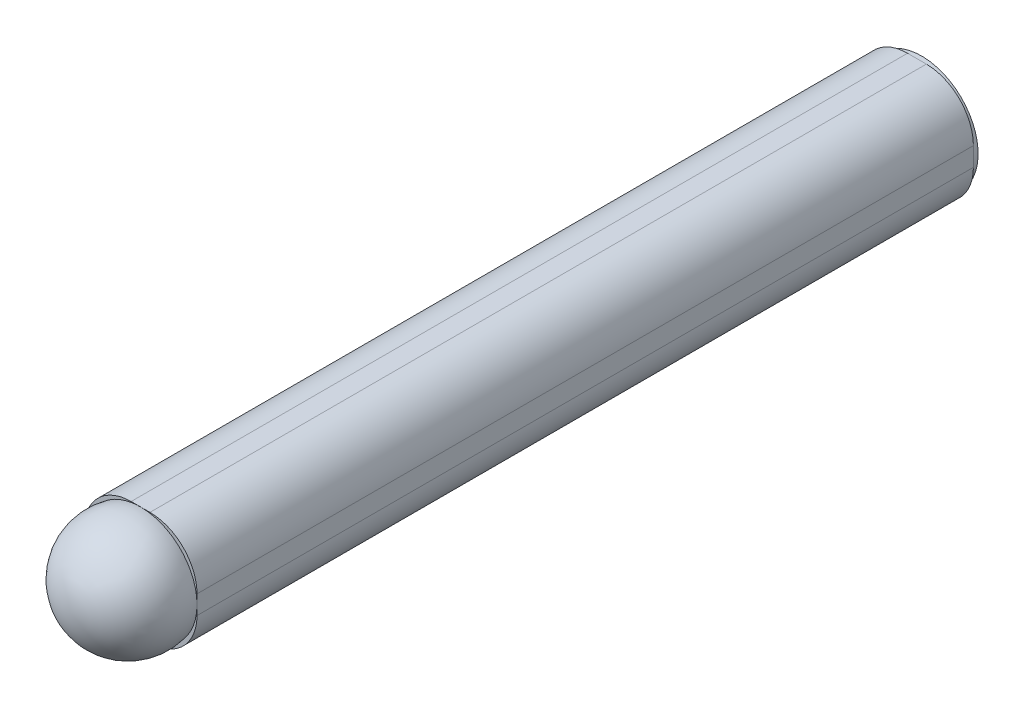
ISO-10303-21;
HEADER;
FILE_DESCRIPTION(('STEP AP214'),'2;1');
FILE_NAME('part.step','',(''),(''),'','','');
FILE_SCHEMA(('AUTOMOTIVE_DESIGN { 1 0 10303 214 1 1 1 1 }'));
ENDSEC;
DATA;
#1=APPLICATION_CONTEXT('core data for automotive mechanical design processes');
#2=APPLICATION_PROTOCOL_DEFINITION('international standard','automotive_design',2000,#1);
#3=PRODUCT_CONTEXT('',#1,'mechanical');
#4=PRODUCT('Part','Part','',(#3));
#5=PRODUCT_RELATED_PRODUCT_CATEGORY('part','',(#4));
#6=PRODUCT_DEFINITION_FORMATION('','',#4);
#7=PRODUCT_DEFINITION_CONTEXT('part definition',#1,'design');
#8=PRODUCT_DEFINITION('design','',#6,#7);
#9=PRODUCT_DEFINITION_SHAPE('','',#8);
#10=(LENGTH_UNIT() NAMED_UNIT(*) SI_UNIT(.MILLI.,.METRE.));
#11=(NAMED_UNIT(*) PLANE_ANGLE_UNIT() SI_UNIT($,.RADIAN.));
#12=(NAMED_UNIT(*) SI_UNIT($,.STERADIAN.) SOLID_ANGLE_UNIT());
#13=UNCERTAINTY_MEASURE_WITH_UNIT(LENGTH_MEASURE(1.E-05),#10,'distance_accuracy_value','');
#14=(GEOMETRIC_REPRESENTATION_CONTEXT(3) GLOBAL_UNCERTAINTY_ASSIGNED_CONTEXT((#13)) GLOBAL_UNIT_ASSIGNED_CONTEXT((#10,
#11,#12)) REPRESENTATION_CONTEXT('',''));
#15=CARTESIAN_POINT('',(0.,0.,0.));
#16=DIRECTION('',(0.,0.,1.));
#17=DIRECTION('',(1.,0.,0.));
#18=AXIS2_PLACEMENT_3D('',#15,#16,#17);
#19=CARTESIAN_POINT('',(0.,0.,0.));
#20=DIRECTION('',(0.,0.,-1.));
#21=DIRECTION('',(-1.,0.,0.));
#22=AXIS2_PLACEMENT_3D('',#19,#20,#21);
#23=PLANE('',#22);
#24=CARTESIAN_POINT('',(0.,0.,0.));
#25=DIRECTION('',(0.,0.,-1.));
#26=DIRECTION('',(-1.,0.,0.));
#27=AXIS2_PLACEMENT_3D('',#24,#25,#26);
#28=CIRCLE('',#27,12.);
#29=CARTESIAN_POINT('',(-12.,0.,0.));
#30=VERTEX_POINT('',#29);
#31=CARTESIAN_POINT('',(0.,12.,0.));
#32=VERTEX_POINT('',#31);
#33=EDGE_CURVE('E57',#30,#32,#28,.T.);
#34=ORIENTED_EDGE('',*,*,#33,.F.);
#35=DIRECTION('',(0.,-1.,0.));
#36=VECTOR('',#35,1.);
#37=CARTESIAN_POINT('',(-12.,-12.,0.));
#38=LINE('',#37,#36);
#39=CARTESIAN_POINT('',(-12.,2.,0.));
#40=VERTEX_POINT('',#39);
#41=EDGE_CURVE('E140',#40,#30,#38,.T.);
#42=ORIENTED_EDGE('',*,*,#41,.F.);
#43=CARTESIAN_POINT('',(-2.,2.,0.));
#44=DIRECTION('',(0.,0.,-1.));
#45=DIRECTION('',(-1.,0.,0.));
#46=AXIS2_PLACEMENT_3D('',#43,#44,#45);
#47=CIRCLE('',#46,10.);
#48=CARTESIAN_POINT('',(-2.,12.,0.));
#49=VERTEX_POINT('',#48);
#50=EDGE_CURVE('E216',#40,#49,#47,.T.);
#51=ORIENTED_EDGE('',*,*,#50,.T.);
#52=DIRECTION('',(-1.,0.,0.));
#53=VECTOR('',#52,1.);
#54=CARTESIAN_POINT('',(-12.,12.,0.));
#55=LINE('',#54,#53);
#56=EDGE_CURVE('E159',#32,#49,#55,.T.);
#57=ORIENTED_EDGE('',*,*,#56,.F.);
#58=EDGE_LOOP('',(#34,#42,#51,#57));
#59=FACE_BOUND('',#58,.T.);
#60=ADVANCED_FACE('F45',(#59),#23,.T.);
#61=CARTESIAN_POINT('',(12.,0.,0.));
#62=VERTEX_POINT('',#61);
#63=EDGE_CURVE('E11',#32,#62,#28,.T.);
#64=ORIENTED_EDGE('',*,*,#63,.F.);
#65=CARTESIAN_POINT('',(2.,12.,0.));
#66=VERTEX_POINT('',#65);
#67=EDGE_CURVE('E157',#66,#32,#55,.T.);
#68=ORIENTED_EDGE('',*,*,#67,.F.);
#69=CARTESIAN_POINT('',(2.,2.,0.));
#70=DIRECTION('',(0.,0.,-1.));
#71=DIRECTION('',(-1.,0.,0.));
#72=AXIS2_PLACEMENT_3D('',#69,#70,#71);
#73=CIRCLE('',#72,10.);
#74=CARTESIAN_POINT('',(12.,2.,0.));
#75=VERTEX_POINT('',#74);
#76=EDGE_CURVE('E221',#66,#75,#73,.T.);
#77=ORIENTED_EDGE('',*,*,#76,.T.);
#78=DIRECTION('',(0.,1.,0.));
#79=VECTOR('',#78,1.);
#80=CARTESIAN_POINT('',(12.,-12.,0.));
#81=LINE('',#80,#79);
#82=EDGE_CURVE('E176',#62,#75,#81,.T.);
#83=ORIENTED_EDGE('',*,*,#82,.F.);
#84=EDGE_LOOP('',(#64,#68,#77,#83));
#85=FACE_BOUND('',#84,.T.);
#86=ADVANCED_FACE('F309',(#85),#23,.T.);
#87=CARTESIAN_POINT('',(0.,-12.,0.));
#88=VERTEX_POINT('',#87);
#89=EDGE_CURVE('E55',#62,#88,#28,.T.);
#90=ORIENTED_EDGE('',*,*,#89,.F.);
#91=CARTESIAN_POINT('',(12.,-2.,0.));
#92=VERTEX_POINT('',#91);
#93=EDGE_CURVE('E194',#92,#62,#81,.T.);
#94=ORIENTED_EDGE('',*,*,#93,.F.);
#95=CARTESIAN_POINT('',(2.,-2.,0.));
#96=DIRECTION('',(0.,0.,-1.));
#97=DIRECTION('',(-1.,0.,0.));
#98=AXIS2_PLACEMENT_3D('',#95,#96,#97);
#99=CIRCLE('',#98,10.);
#100=CARTESIAN_POINT('',(2.,-12.,0.));
#101=VERTEX_POINT('',#100);
#102=EDGE_CURVE('E225',#92,#101,#99,.T.);
#103=ORIENTED_EDGE('',*,*,#102,.T.);
#104=DIRECTION('',(1.,0.,0.));
#105=VECTOR('',#104,1.);
#106=CARTESIAN_POINT('',(-12.,-12.,0.));
#107=LINE('',#106,#105);
#108=EDGE_CURVE('E151',#88,#101,#107,.T.);
#109=ORIENTED_EDGE('',*,*,#108,.F.);
#110=EDGE_LOOP('',(#90,#94,#103,#109));
#111=FACE_BOUND('',#110,.T.);
#112=ADVANCED_FACE('F314',(#111),#23,.T.);
#113=CARTESIAN_POINT('',(0.,0.,165.));
#114=DIRECTION('',(0.,0.,-1.));
#115=DIRECTION('',(-1.,0.,0.));
#116=AXIS2_PLACEMENT_3D('',#113,#114,#115);
#117=PLANE('',#116);
#118=DIRECTION('',(0.,-1.,0.));
#119=VECTOR('',#118,1.);
#120=CARTESIAN_POINT('',(-12.,-12.,165.));
#121=LINE('',#120,#119);
#122=CARTESIAN_POINT('',(-12.,0.,165.));
#123=VERTEX_POINT('',#122);
#124=CARTESIAN_POINT('',(-12.,-2.,165.));
#125=VERTEX_POINT('',#124);
#126=EDGE_CURVE('E185',#123,#125,#121,.T.);
#127=ORIENTED_EDGE('',*,*,#126,.T.);
#128=CARTESIAN_POINT('',(-2.,-2.,165.));
#129=DIRECTION('',(0.,0.,-1.));
#130=DIRECTION('',(-1.,0.,0.));
#131=AXIS2_PLACEMENT_3D('',#128,#129,#130);
#132=CIRCLE('',#131,10.);
#133=CARTESIAN_POINT('',(-2.,-12.,165.));
#134=VERTEX_POINT('',#133);
#135=EDGE_CURVE('E169',#125,#134,#132,.F.);
#136=ORIENTED_EDGE('',*,*,#135,.T.);
#137=DIRECTION('',(1.,0.,0.));
#138=VECTOR('',#137,1.);
#139=CARTESIAN_POINT('',(-12.,-12.,165.));
#140=LINE('',#139,#138);
#141=CARTESIAN_POINT('',(0.,-12.,165.));
#142=VERTEX_POINT('',#141);
#143=EDGE_CURVE('E190',#134,#142,#140,.T.);
#144=ORIENTED_EDGE('',*,*,#143,.T.);
#145=CARTESIAN_POINT('',(0.,0.,165.));
#146=DIRECTION('',(0.,0.,-1.));
#147=DIRECTION('',(-1.,0.,0.));
#148=AXIS2_PLACEMENT_3D('',#145,#146,#147);
#149=CIRCLE('',#148,12.);
#150=EDGE_CURVE('E204',#123,#142,#149,.F.);
#151=ORIENTED_EDGE('',*,*,#150,.F.);
#152=EDGE_LOOP('',(#127,#136,#144,#151));
#153=FACE_BOUND('',#152,.T.);
#154=ADVANCED_FACE('F258',(#153),#117,.F.);
#155=CARTESIAN_POINT('',(2.,-12.,165.));
#156=VERTEX_POINT('',#155);
#157=EDGE_CURVE('E189',#142,#156,#140,.T.);
#158=ORIENTED_EDGE('',*,*,#157,.T.);
#159=CARTESIAN_POINT('',(2.,-2.,165.));
#160=DIRECTION('',(0.,0.,-1.));
#161=DIRECTION('',(-1.,0.,0.));
#162=AXIS2_PLACEMENT_3D('',#159,#160,#161);
#163=CIRCLE('',#162,10.);
#164=CARTESIAN_POINT('',(12.,-2.,165.));
#165=VERTEX_POINT('',#164);
#166=EDGE_CURVE('E236',#156,#165,#163,.F.);
#167=ORIENTED_EDGE('',*,*,#166,.T.);
#168=DIRECTION('',(0.,1.,0.));
#169=VECTOR('',#168,1.);
#170=CARTESIAN_POINT('',(12.,-12.,165.));
#171=LINE('',#170,#169);
#172=CARTESIAN_POINT('',(12.,0.,165.));
#173=VERTEX_POINT('',#172);
#174=EDGE_CURVE('E177',#165,#173,#171,.T.);
#175=ORIENTED_EDGE('',*,*,#174,.T.);
#176=EDGE_CURVE('E209',#142,#173,#149,.F.);
#177=ORIENTED_EDGE('',*,*,#176,.F.);
#178=EDGE_LOOP('',(#158,#167,#175,#177));
#179=FACE_BOUND('',#178,.T.);
#180=ADVANCED_FACE('F330',(#179),#117,.F.);
#181=CARTESIAN_POINT('',(12.,2.,165.));
#182=VERTEX_POINT('',#181);
#183=EDGE_CURVE('E181',#173,#182,#171,.T.);
#184=ORIENTED_EDGE('',*,*,#183,.T.);
#185=CARTESIAN_POINT('',(2.,2.,165.));
#186=DIRECTION('',(0.,0.,-1.));
#187=DIRECTION('',(-1.,0.,0.));
#188=AXIS2_PLACEMENT_3D('',#185,#186,#187);
#189=CIRCLE('',#188,10.);
#190=CARTESIAN_POINT('',(2.,12.,165.));
#191=VERTEX_POINT('',#190);
#192=EDGE_CURVE('E246',#182,#191,#189,.F.);
#193=ORIENTED_EDGE('',*,*,#192,.T.);
#194=DIRECTION('',(-1.,0.,0.));
#195=VECTOR('',#194,1.);
#196=CARTESIAN_POINT('',(-12.,12.,165.));
#197=LINE('',#196,#195);
#198=CARTESIAN_POINT('',(0.,12.,165.));
#199=VERTEX_POINT('',#198);
#200=EDGE_CURVE('E182',#191,#199,#197,.T.);
#201=ORIENTED_EDGE('',*,*,#200,.T.);
#202=EDGE_CURVE('E193',#173,#199,#149,.F.);
#203=ORIENTED_EDGE('',*,*,#202,.F.);
#204=EDGE_LOOP('',(#184,#193,#201,#203));
#205=FACE_BOUND('',#204,.T.);
#206=ADVANCED_FACE('F323',(#205),#117,.F.);
#207=CARTESIAN_POINT('',(12.,-12.,165.));
#208=DIRECTION('',(-1.,0.,0.));
#209=DIRECTION('',(0.,0.,1.));
#210=AXIS2_PLACEMENT_3D('',#207,#208,#209);
#211=PLANE('',#210);
#212=ORIENTED_EDGE('',*,*,#174,.F.);
#213=DIRECTION('',(0.,0.,-1.));
#214=VECTOR('',#213,1.);
#215=CARTESIAN_POINT('',(12.,-2.,165.));
#216=LINE('',#215,#214);
#217=EDGE_CURVE('E212',#165,#92,#216,.T.);
#218=ORIENTED_EDGE('',*,*,#217,.T.);
#219=ORIENTED_EDGE('',*,*,#93,.T.);
#220=ORIENTED_EDGE('',*,*,#82,.T.);
#221=DIRECTION('',(0.,0.,-1.));
#222=VECTOR('',#221,1.);
#223=CARTESIAN_POINT('',(12.,2.,165.));
#224=LINE('',#223,#222);
#225=EDGE_CURVE('E208',#75,#182,#224,.F.);
#226=ORIENTED_EDGE('',*,*,#225,.T.);
#227=ORIENTED_EDGE('',*,*,#183,.F.);
#228=EDGE_LOOP('',(#212,#218,#219,#220,#226,#227));
#229=FACE_BOUND('',#228,.T.);
#230=ADVANCED_FACE('F335',(#229),#211,.F.);
#231=CARTESIAN_POINT('',(-12.,12.,165.));
#232=DIRECTION('',(0.,-1.,0.));
#233=DIRECTION('',(0.,0.,-1.));
#234=AXIS2_PLACEMENT_3D('',#231,#232,#233);
#235=PLANE('',#234);
#236=ORIENTED_EDGE('',*,*,#200,.F.);
#237=DIRECTION('',(0.,0.,-1.));
#238=VECTOR('',#237,1.);
#239=CARTESIAN_POINT('',(2.,12.,165.));
#240=LINE('',#239,#238);
#241=EDGE_CURVE('E242',#191,#66,#240,.T.);
#242=ORIENTED_EDGE('',*,*,#241,.T.);
#243=ORIENTED_EDGE('',*,*,#67,.T.);
#244=ORIENTED_EDGE('',*,*,#56,.T.);
#245=DIRECTION('',(0.,0.,-1.));
#246=VECTOR('',#245,1.);
#247=CARTESIAN_POINT('',(-2.,12.,165.));
#248=LINE('',#247,#246);
#249=CARTESIAN_POINT('',(-2.,12.,165.));
#250=VERTEX_POINT('',#249);
#251=EDGE_CURVE('E239',#49,#250,#248,.F.);
#252=ORIENTED_EDGE('',*,*,#251,.T.);
#253=EDGE_CURVE('E180',#199,#250,#197,.T.);
#254=ORIENTED_EDGE('',*,*,#253,.F.);
#255=EDGE_LOOP('',(#236,#242,#243,#244,#252,#254));
#256=FACE_BOUND('',#255,.T.);
#257=ADVANCED_FACE('F283',(#256),#235,.F.);
#258=CARTESIAN_POINT('',(-12.,-12.,165.));
#259=DIRECTION('',(1.,0.,0.));
#260=DIRECTION('',(0.,0.,-1.));
#261=AXIS2_PLACEMENT_3D('',#258,#259,#260);
#262=PLANE('',#261);
#263=ORIENTED_EDGE('',*,*,#41,.T.);
#264=CARTESIAN_POINT('',(-12.,-2.,0.));
#265=VERTEX_POINT('',#264);
#266=EDGE_CURVE('E142',#30,#265,#38,.T.);
#267=ORIENTED_EDGE('',*,*,#266,.T.);
#268=DIRECTION('',(0.,0.,-1.));
#269=VECTOR('',#268,1.);
#270=CARTESIAN_POINT('',(-12.,-2.,165.));
#271=LINE('',#270,#269);
#272=EDGE_CURVE('E251',#265,#125,#271,.F.);
#273=ORIENTED_EDGE('',*,*,#272,.T.);
#274=ORIENTED_EDGE('',*,*,#126,.F.);
#275=CARTESIAN_POINT('',(-12.,2.,165.));
#276=VERTEX_POINT('',#275);
#277=EDGE_CURVE('E186',#276,#123,#121,.T.);
#278=ORIENTED_EDGE('',*,*,#277,.F.);
#279=DIRECTION('',(0.,0.,-1.));
#280=VECTOR('',#279,1.);
#281=CARTESIAN_POINT('',(-12.,2.,165.));
#282=LINE('',#281,#280);
#283=EDGE_CURVE('E146',#276,#40,#282,.T.);
#284=ORIENTED_EDGE('',*,*,#283,.T.);
#285=EDGE_LOOP('',(#263,#267,#273,#274,#278,#284));
#286=FACE_BOUND('',#285,.T.);
#287=ADVANCED_FACE('F141',(#286),#262,.F.);
#288=CARTESIAN_POINT('',(-12.,-12.,165.));
#289=DIRECTION('',(0.,1.,0.));
#290=DIRECTION('',(0.,0.,1.));
#291=AXIS2_PLACEMENT_3D('',#288,#289,#290);
#292=PLANE('',#291);
#293=CARTESIAN_POINT('',(-2.,-12.,0.));
#294=VERTEX_POINT('',#293);
#295=EDGE_CURVE('E200',#294,#88,#107,.T.);
#296=ORIENTED_EDGE('',*,*,#295,.T.);
#297=ORIENTED_EDGE('',*,*,#108,.T.);
#298=DIRECTION('',(0.,0.,-1.));
#299=VECTOR('',#298,1.);
#300=CARTESIAN_POINT('',(2.,-12.,165.));
#301=LINE('',#300,#299);
#302=EDGE_CURVE('E233',#101,#156,#301,.F.);
#303=ORIENTED_EDGE('',*,*,#302,.T.);
#304=ORIENTED_EDGE('',*,*,#157,.F.);
#305=ORIENTED_EDGE('',*,*,#143,.F.);
#306=DIRECTION('',(0.,0.,-1.));
#307=VECTOR('',#306,1.);
#308=CARTESIAN_POINT('',(-2.,-12.,165.));
#309=LINE('',#308,#307);
#310=EDGE_CURVE('E229',#134,#294,#309,.T.);
#311=ORIENTED_EDGE('',*,*,#310,.T.);
#312=EDGE_LOOP('',(#296,#297,#303,#304,#305,#311));
#313=FACE_BOUND('',#312,.T.);
#314=ADVANCED_FACE('F266',(#313),#292,.F.);
#315=ORIENTED_EDGE('',*,*,#253,.T.);
#316=CARTESIAN_POINT('',(-2.,2.,165.));
#317=DIRECTION('',(0.,0.,-1.));
#318=DIRECTION('',(-1.,0.,0.));
#319=AXIS2_PLACEMENT_3D('',#316,#317,#318);
#320=CIRCLE('',#319,10.);
#321=EDGE_CURVE('E49',#250,#276,#320,.F.);
#322=ORIENTED_EDGE('',*,*,#321,.T.);
#323=ORIENTED_EDGE('',*,*,#277,.T.);
#324=CARTESIAN_POINT('',(0.,0.,165.));
#325=DIRECTION('',(0.,0.,-1.));
#326=DIRECTION('',(-1.,0.,0.));
#327=AXIS2_PLACEMENT_3D('',#324,#325,#326);
#328=CIRCLE('',#327,12.);
#329=EDGE_CURVE('E172',#123,#199,#328,.T.);
#330=ORIENTED_EDGE('',*,*,#329,.T.);
#331=EDGE_LOOP('',(#315,#322,#323,#330));
#332=FACE_BOUND('',#331,.T.);
#333=ADVANCED_FACE('F279',(#332),#117,.F.);
#334=EDGE_CURVE('E70',#88,#30,#28,.T.);
#335=ORIENTED_EDGE('',*,*,#334,.F.);
#336=ORIENTED_EDGE('',*,*,#295,.F.);
#337=CARTESIAN_POINT('',(-2.,-2.,0.));
#338=DIRECTION('',(0.,0.,-1.));
#339=DIRECTION('',(-1.,0.,0.));
#340=AXIS2_PLACEMENT_3D('',#337,#338,#339);
#341=CIRCLE('',#340,10.);
#342=EDGE_CURVE('E154',#294,#265,#341,.T.);
#343=ORIENTED_EDGE('',*,*,#342,.T.);
#344=ORIENTED_EDGE('',*,*,#266,.F.);
#345=EDGE_LOOP('',(#335,#336,#343,#344));
#346=FACE_BOUND('',#345,.T.);
#347=ADVANCED_FACE('F153',(#346),#23,.T.);
#348=CARTESIAN_POINT('',(0.,0.,167.7));
#349=DIRECTION('',(0.,0.,-1.));
#350=DIRECTION('',(-1.,0.,0.));
#351=AXIS2_PLACEMENT_3D('',#348,#349,#350);
#352=SPHERICAL_SURFACE('',#351,12.3);
#353=ORIENTED_EDGE('',*,*,#329,.F.);
#354=ORIENTED_EDGE('',*,*,#150,.T.);
#355=ORIENTED_EDGE('',*,*,#176,.T.);
#356=ORIENTED_EDGE('',*,*,#202,.T.);
#357=EDGE_LOOP('',(#353,#354,#355,#356));
#358=FACE_BOUND('',#357,.T.);
#359=ADVANCED_FACE('F274',(#358),#352,.T.);
#360=CARTESIAN_POINT('',(2.,-2.,165.));
#361=DIRECTION('',(0.,0.,-1.));
#362=DIRECTION('',(-1.,0.,0.));
#363=AXIS2_PLACEMENT_3D('',#360,#361,#362);
#364=CYLINDRICAL_SURFACE('',#363,10.);
#365=ORIENTED_EDGE('',*,*,#166,.F.);
#366=ORIENTED_EDGE('',*,*,#302,.F.);
#367=ORIENTED_EDGE('',*,*,#102,.F.);
#368=ORIENTED_EDGE('',*,*,#217,.F.);
#369=EDGE_LOOP('',(#365,#366,#367,#368));
#370=FACE_BOUND('',#369,.T.);
#371=ADVANCED_FACE('F321',(#370),#364,.T.);
#372=CARTESIAN_POINT('',(2.,2.,165.));
#373=DIRECTION('',(0.,0.,-1.));
#374=DIRECTION('',(-1.,0.,0.));
#375=AXIS2_PLACEMENT_3D('',#372,#373,#374);
#376=CYLINDRICAL_SURFACE('',#375,10.);
#377=ORIENTED_EDGE('',*,*,#192,.F.);
#378=ORIENTED_EDGE('',*,*,#225,.F.);
#379=ORIENTED_EDGE('',*,*,#76,.F.);
#380=ORIENTED_EDGE('',*,*,#241,.F.);
#381=EDGE_LOOP('',(#377,#378,#379,#380));
#382=FACE_BOUND('',#381,.T.);
#383=ADVANCED_FACE('F348',(#382),#376,.T.);
#384=CARTESIAN_POINT('',(-2.,-2.,165.));
#385=DIRECTION('',(0.,0.,-1.));
#386=DIRECTION('',(-1.,0.,0.));
#387=AXIS2_PLACEMENT_3D('',#384,#385,#386);
#388=CYLINDRICAL_SURFACE('',#387,10.);
#389=ORIENTED_EDGE('',*,*,#135,.F.);
#390=ORIENTED_EDGE('',*,*,#272,.F.);
#391=ORIENTED_EDGE('',*,*,#342,.F.);
#392=ORIENTED_EDGE('',*,*,#310,.F.);
#393=EDGE_LOOP('',(#389,#390,#391,#392));
#394=FACE_BOUND('',#393,.T.);
#395=ADVANCED_FACE('F268',(#394),#388,.T.);
#396=CARTESIAN_POINT('',(-2.,2.,165.));
#397=DIRECTION('',(0.,0.,-1.));
#398=DIRECTION('',(-1.,0.,0.));
#399=AXIS2_PLACEMENT_3D('',#396,#397,#398);
#400=CYLINDRICAL_SURFACE('',#399,10.);
#401=ORIENTED_EDGE('',*,*,#321,.F.);
#402=ORIENTED_EDGE('',*,*,#251,.F.);
#403=ORIENTED_EDGE('',*,*,#50,.F.);
#404=ORIENTED_EDGE('',*,*,#283,.F.);
#405=EDGE_LOOP('',(#401,#402,#403,#404));
#406=FACE_BOUND('',#405,.T.);
#407=ADVANCED_FACE('F47',(#406),#400,.T.);
#408=CARTESIAN_POINT('',(0.,0.,-1.));
#409=DIRECTION('',(0.,0.,1.));
#410=DIRECTION('',(1.,0.,0.));
#411=AXIS2_PLACEMENT_3D('',#408,#409,#410);
#412=CYLINDRICAL_SURFACE('',#411,12.);
#413=CARTESIAN_POINT('',(0.,0.,-1.));
#414=DIRECTION('',(0.,0.,-1.));
#415=DIRECTION('',(-1.,0.,0.));
#416=AXIS2_PLACEMENT_3D('',#413,#414,#415);
#417=CIRCLE('',#416,12.);
#418=CARTESIAN_POINT('',(-12.,0.,-1.));
#419=VERTEX_POINT('',#418);
#420=EDGE_CURVE('E163',#419,#419,#417,.T.);
#421=ORIENTED_EDGE('',*,*,#420,.F.);
#422=EDGE_LOOP('',(#421));
#423=FACE_BOUND('',#422,.T.);
#424=ORIENTED_EDGE('',*,*,#33,.T.);
#425=ORIENTED_EDGE('',*,*,#63,.T.);
#426=ORIENTED_EDGE('',*,*,#89,.T.);
#427=ORIENTED_EDGE('',*,*,#334,.T.);
#428=EDGE_LOOP('',(#424,#425,#426,#427));
#429=FACE_BOUND('',#428,.T.);
#430=ADVANCED_FACE('F165',(#423,#429),#412,.T.);
#431=CARTESIAN_POINT('',(0.,0.,-1.));
#432=DIRECTION('',(0.,0.,-1.));
#433=DIRECTION('',(-1.,0.,0.));
#434=AXIS2_PLACEMENT_3D('',#431,#432,#433);
#435=PLANE('',#434);
#436=ORIENTED_EDGE('',*,*,#420,.T.);
#437=EDGE_LOOP('',(#436));
#438=FACE_BOUND('',#437,.T.);
#439=ADVANCED_FACE('F296',(#438),#435,.T.);
#440=CLOSED_SHELL('',(#60,#86,#112,#154,#180,#206,#230,#257,#287,#314,#333,#347,#359,#371,#383,
#395,#407,#430,#439));
#441=MANIFOLD_SOLID_BREP('B2',#440);
#442=ADVANCED_BREP_SHAPE_REPRESENTATION('',(#18,#441),#14);
#443=SHAPE_DEFINITION_REPRESENTATION(#9,#442);
ENDSEC;
END-ISO-10303-21;
